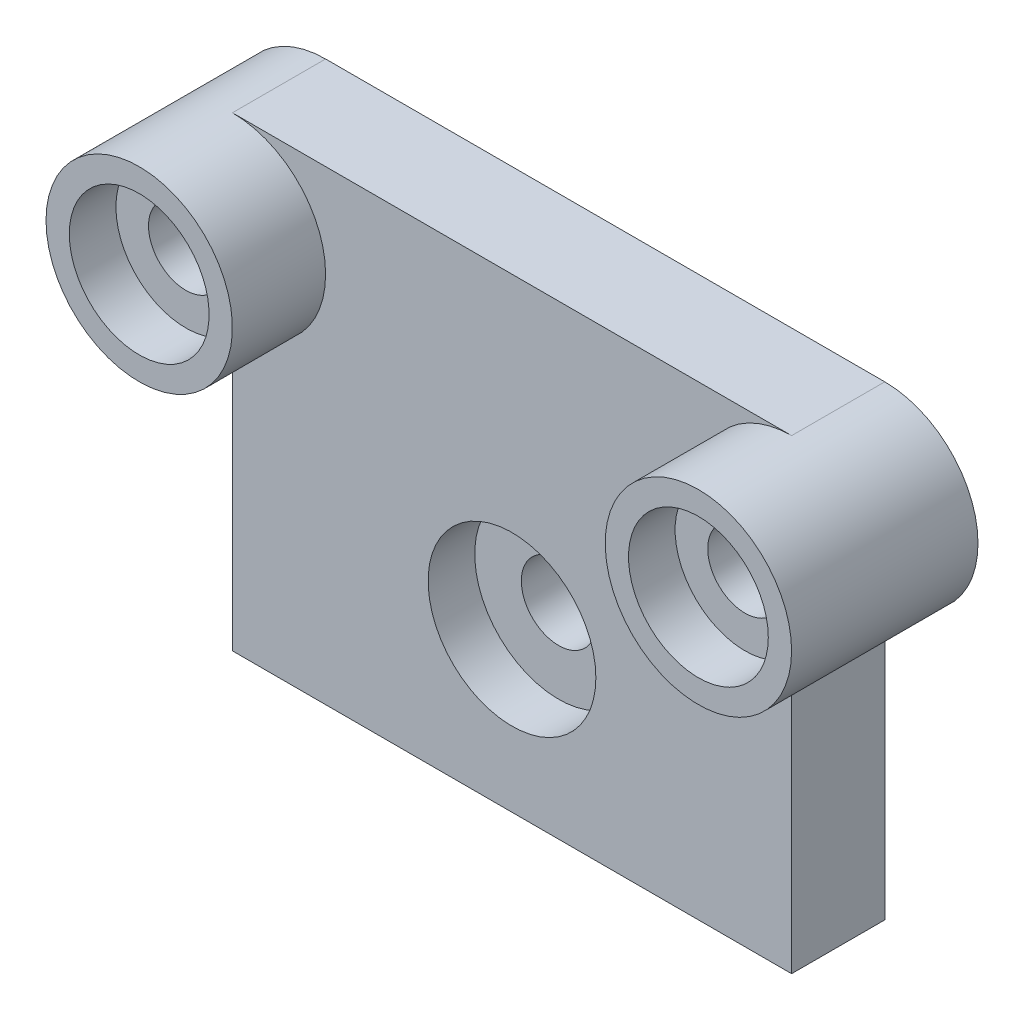
ISO-10303-21;
HEADER;
FILE_DESCRIPTION(('STEP AP214'),'2;1');
FILE_NAME('part.step','',(''),(''),'','','');
FILE_SCHEMA(('AUTOMOTIVE_DESIGN { 1 0 10303 214 1 1 1 1 }'));
ENDSEC;
DATA;
#1=APPLICATION_CONTEXT('core data for automotive mechanical design processes');
#2=APPLICATION_PROTOCOL_DEFINITION('international standard','automotive_design',2000,#1);
#3=PRODUCT_CONTEXT('',#1,'mechanical');
#4=PRODUCT('Part','Part','',(#3));
#5=PRODUCT_RELATED_PRODUCT_CATEGORY('part','',(#4));
#6=PRODUCT_DEFINITION_FORMATION('','',#4);
#7=PRODUCT_DEFINITION_CONTEXT('part definition',#1,'design');
#8=PRODUCT_DEFINITION('design','',#6,#7);
#9=PRODUCT_DEFINITION_SHAPE('','',#8);
#10=(LENGTH_UNIT() NAMED_UNIT(*) SI_UNIT(.MILLI.,.METRE.));
#11=(NAMED_UNIT(*) PLANE_ANGLE_UNIT() SI_UNIT($,.RADIAN.));
#12=(NAMED_UNIT(*) SI_UNIT($,.STERADIAN.) SOLID_ANGLE_UNIT());
#13=UNCERTAINTY_MEASURE_WITH_UNIT(LENGTH_MEASURE(1.E-05),#10,'distance_accuracy_value','');
#14=(GEOMETRIC_REPRESENTATION_CONTEXT(3) GLOBAL_UNCERTAINTY_ASSIGNED_CONTEXT((#13)) GLOBAL_UNIT_ASSIGNED_CONTEXT((#10,
#11,#12)) REPRESENTATION_CONTEXT('',''));
#15=CARTESIAN_POINT('',(0.,0.,0.));
#16=DIRECTION('',(0.,0.,1.));
#17=DIRECTION('',(1.,0.,0.));
#18=AXIS2_PLACEMENT_3D('',#15,#16,#17);
#19=CARTESIAN_POINT('',(-15.,-8.,10.));
#20=DIRECTION('',(0.,0.,-1.));
#21=DIRECTION('',(-1.,0.,0.));
#22=AXIS2_PLACEMENT_3D('',#19,#20,#21);
#23=CYLINDRICAL_SURFACE('',#22,4.);
#24=CARTESIAN_POINT('',(-15.,-8.,0.));
#25=DIRECTION('',(0.,0.,1.));
#26=DIRECTION('',(1.,0.,0.));
#27=AXIS2_PLACEMENT_3D('',#24,#25,#26);
#28=CIRCLE('',#27,4.);
#29=CARTESIAN_POINT('',(-11.,-8.,0.));
#30=VERTEX_POINT('',#29);
#31=EDGE_CURVE('E108',#30,#30,#28,.T.);
#32=ORIENTED_EDGE('',*,*,#31,.F.);
#33=EDGE_LOOP('',(#32));
#34=FACE_BOUND('',#33,.T.);
#35=CARTESIAN_POINT('',(-15.,-8.,5.));
#36=DIRECTION('',(0.,0.,1.));
#37=DIRECTION('',(1.,0.,0.));
#38=AXIS2_PLACEMENT_3D('',#35,#36,#37);
#39=CIRCLE('',#38,4.);
#40=CARTESIAN_POINT('',(-11.,-8.,5.));
#41=VERTEX_POINT('',#40);
#42=EDGE_CURVE('E51',#41,#41,#39,.T.);
#43=ORIENTED_EDGE('',*,*,#42,.T.);
#44=EDGE_LOOP('',(#43));
#45=FACE_BOUND('',#44,.T.);
#46=ADVANCED_FACE('F47',(#34,#45),#23,.F.);
#47=CARTESIAN_POINT('',(-45.,15.,10.));
#48=DIRECTION('',(0.,0.,-1.));
#49=DIRECTION('',(-1.,0.,0.));
#50=AXIS2_PLACEMENT_3D('',#47,#48,#49);
#51=CYLINDRICAL_SURFACE('',#50,4.);
#52=CARTESIAN_POINT('',(-45.,15.,0.));
#53=DIRECTION('',(0.,0.,-1.));
#54=DIRECTION('',(-1.,0.,0.));
#55=AXIS2_PLACEMENT_3D('',#52,#53,#54);
#56=CIRCLE('',#55,4.);
#57=CARTESIAN_POINT('',(-49.,15.,0.));
#58=VERTEX_POINT('',#57);
#59=EDGE_CURVE('E152',#58,#58,#56,.T.);
#60=ORIENTED_EDGE('',*,*,#59,.T.);
#61=EDGE_LOOP('',(#60));
#62=FACE_BOUND('',#61,.T.);
#63=CARTESIAN_POINT('',(-45.,15.,15.));
#64=DIRECTION('',(0.,0.,1.));
#65=DIRECTION('',(1.,0.,0.));
#66=AXIS2_PLACEMENT_3D('',#63,#64,#65);
#67=CIRCLE('',#66,4.);
#68=CARTESIAN_POINT('',(-41.,15.,15.));
#69=VERTEX_POINT('',#68);
#70=EDGE_CURVE('E125',#69,#69,#67,.F.);
#71=ORIENTED_EDGE('',*,*,#70,.F.);
#72=EDGE_LOOP('',(#71));
#73=FACE_BOUND('',#72,.T.);
#74=ADVANCED_FACE('F192',(#62,#73),#51,.F.);
#75=CARTESIAN_POINT('',(-30.,0.,20.));
#76=DIRECTION('',(0.,0.,1.));
#77=DIRECTION('',(-1.,0.,0.));
#78=AXIS2_PLACEMENT_3D('',#75,#76,#77);
#79=PLANE('',#78);
#80=CARTESIAN_POINT('',(-45.,15.,20.));
#81=DIRECTION('',(0.,0.,-1.));
#82=DIRECTION('',(-1.,0.,0.));
#83=AXIS2_PLACEMENT_3D('',#80,#81,#82);
#84=CIRCLE('',#83,10.);
#85=CARTESIAN_POINT('',(-55.,15.,20.));
#86=VERTEX_POINT('',#85);
#87=EDGE_CURVE('E127',#86,#86,#84,.T.);
#88=ORIENTED_EDGE('',*,*,#87,.F.);
#89=EDGE_LOOP('',(#88));
#90=FACE_BOUND('',#89,.T.);
#91=CARTESIAN_POINT('',(-45.,15.,20.));
#92=DIRECTION('',(0.,0.,-1.));
#93=DIRECTION('',(-1.,0.,0.));
#94=AXIS2_PLACEMENT_3D('',#91,#92,#93);
#95=CIRCLE('',#94,7.5);
#96=CARTESIAN_POINT('',(-52.5,15.,20.));
#97=VERTEX_POINT('',#96);
#98=EDGE_CURVE('E135',#97,#97,#95,.T.);
#99=ORIENTED_EDGE('',*,*,#98,.T.);
#100=EDGE_LOOP('',(#99));
#101=FACE_BOUND('',#100,.T.);
#102=ADVANCED_FACE('F197',(#90,#101),#79,.T.);
#103=CARTESIAN_POINT('',(15.,15.,10.));
#104=DIRECTION('',(0.,0.,-1.));
#105=DIRECTION('',(-1.,0.,0.));
#106=AXIS2_PLACEMENT_3D('',#103,#104,#105);
#107=CYLINDRICAL_SURFACE('',#106,4.);
#108=CARTESIAN_POINT('',(15.,15.,0.));
#109=DIRECTION('',(0.,0.,1.));
#110=DIRECTION('',(1.,0.,0.));
#111=AXIS2_PLACEMENT_3D('',#108,#109,#110);
#112=CIRCLE('',#111,4.);
#113=CARTESIAN_POINT('',(19.,15.,0.));
#114=VERTEX_POINT('',#113);
#115=EDGE_CURVE('E91',#114,#114,#112,.T.);
#116=ORIENTED_EDGE('',*,*,#115,.F.);
#117=EDGE_LOOP('',(#116));
#118=FACE_BOUND('',#117,.T.);
#119=CARTESIAN_POINT('',(15.,15.,15.));
#120=DIRECTION('',(0.,0.,1.));
#121=DIRECTION('',(1.,0.,0.));
#122=AXIS2_PLACEMENT_3D('',#119,#120,#121);
#123=CIRCLE('',#122,4.);
#124=CARTESIAN_POINT('',(19.,15.,15.));
#125=VERTEX_POINT('',#124);
#126=EDGE_CURVE('E122',#125,#125,#123,.T.);
#127=ORIENTED_EDGE('',*,*,#126,.T.);
#128=EDGE_LOOP('',(#127));
#129=FACE_BOUND('',#128,.T.);
#130=ADVANCED_FACE('F215',(#118,#129),#107,.F.);
#131=CARTESIAN_POINT('',(0.,0.,10.));
#132=DIRECTION('',(0.,0.,1.));
#133=DIRECTION('',(1.,0.,0.));
#134=AXIS2_PLACEMENT_3D('',#131,#132,#133);
#135=PLANE('',#134);
#136=CARTESIAN_POINT('',(-15.,-8.,10.));
#137=DIRECTION('',(0.,0.,1.));
#138=DIRECTION('',(1.,0.,0.));
#139=AXIS2_PLACEMENT_3D('',#136,#137,#138);
#140=CIRCLE('',#139,9.);
#141=CARTESIAN_POINT('',(-6.,-8.,10.));
#142=VERTEX_POINT('',#141);
#143=EDGE_CURVE('E142',#142,#142,#140,.T.);
#144=ORIENTED_EDGE('',*,*,#143,.F.);
#145=EDGE_LOOP('',(#144));
#146=FACE_BOUND('',#145,.T.);
#147=CARTESIAN_POINT('',(-45.,15.,10.));
#148=DIRECTION('',(0.,0.,1.));
#149=DIRECTION('',(1.,0.,0.));
#150=AXIS2_PLACEMENT_3D('',#147,#148,#149);
#151=CIRCLE('',#150,10.);
#152=CARTESIAN_POINT('',(-45.,5.,10.));
#153=VERTEX_POINT('',#152);
#154=CARTESIAN_POINT('',(-45.,25.,10.));
#155=VERTEX_POINT('',#154);
#156=EDGE_CURVE('E132',#153,#155,#151,.T.);
#157=ORIENTED_EDGE('',*,*,#156,.F.);
#158=DIRECTION('',(0.,1.,0.));
#159=VECTOR('',#158,1.);
#160=CARTESIAN_POINT('',(-45.,0.,10.));
#161=LINE('',#160,#159);
#162=CARTESIAN_POINT('',(-45.,-25.,10.));
#163=VERTEX_POINT('',#162);
#164=EDGE_CURVE('E148',#163,#153,#161,.T.);
#165=ORIENTED_EDGE('',*,*,#164,.F.);
#166=DIRECTION('',(1.,0.,0.));
#167=VECTOR('',#166,1.);
#168=CARTESIAN_POINT('',(0.,-25.,10.));
#169=LINE('',#168,#167);
#170=CARTESIAN_POINT('',(15.,-25.,10.));
#171=VERTEX_POINT('',#170);
#172=EDGE_CURVE('E173',#163,#171,#169,.T.);
#173=ORIENTED_EDGE('',*,*,#172,.T.);
#174=DIRECTION('',(0.,1.,0.));
#175=VECTOR('',#174,1.);
#176=CARTESIAN_POINT('',(15.,0.,10.));
#177=LINE('',#176,#175);
#178=CARTESIAN_POINT('',(15.,5.,10.));
#179=VERTEX_POINT('',#178);
#180=EDGE_CURVE('E66',#171,#179,#177,.T.);
#181=ORIENTED_EDGE('',*,*,#180,.T.);
#182=CARTESIAN_POINT('',(15.,15.,10.));
#183=DIRECTION('',(0.,0.,1.));
#184=DIRECTION('',(1.,0.,0.));
#185=AXIS2_PLACEMENT_3D('',#182,#183,#184);
#186=CIRCLE('',#185,10.);
#187=CARTESIAN_POINT('',(15.,25.,10.));
#188=VERTEX_POINT('',#187);
#189=EDGE_CURVE('E99',#179,#188,#186,.F.);
#190=ORIENTED_EDGE('',*,*,#189,.T.);
#191=DIRECTION('',(1.,0.,0.));
#192=VECTOR('',#191,1.);
#193=CARTESIAN_POINT('',(0.,25.,10.));
#194=LINE('',#193,#192);
#195=EDGE_CURVE('E119',#155,#188,#194,.T.);
#196=ORIENTED_EDGE('',*,*,#195,.F.);
#197=EDGE_LOOP('',(#157,#165,#173,#181,#190,#196));
#198=FACE_BOUND('',#197,.T.);
#199=ADVANCED_FACE('F177',(#146,#198),#135,.T.);
#200=CARTESIAN_POINT('',(15.,15.,10.));
#201=DIRECTION('',(0.,0.,-1.));
#202=DIRECTION('',(-1.,0.,0.));
#203=AXIS2_PLACEMENT_3D('',#200,#201,#202);
#204=CYLINDRICAL_SURFACE('',#203,10.);
#205=CARTESIAN_POINT('',(15.,15.,0.));
#206=DIRECTION('',(0.,0.,1.));
#207=DIRECTION('',(1.,0.,0.));
#208=AXIS2_PLACEMENT_3D('',#205,#206,#207);
#209=CIRCLE('',#208,10.);
#210=CARTESIAN_POINT('',(15.,5.,0.));
#211=VERTEX_POINT('',#210);
#212=CARTESIAN_POINT('',(15.,25.,0.));
#213=VERTEX_POINT('',#212);
#214=EDGE_CURVE('E97',#211,#213,#209,.T.);
#215=ORIENTED_EDGE('',*,*,#214,.T.);
#216=DIRECTION('',(0.,0.,-1.));
#217=VECTOR('',#216,1.);
#218=CARTESIAN_POINT('',(15.,25.,10.));
#219=LINE('',#218,#217);
#220=EDGE_CURVE('E13',#188,#213,#219,.T.);
#221=ORIENTED_EDGE('',*,*,#220,.F.);
#222=ORIENTED_EDGE('',*,*,#189,.F.);
#223=DIRECTION('',(0.,0.,-1.));
#224=VECTOR('',#223,1.);
#225=CARTESIAN_POINT('',(15.,5.,10.));
#226=LINE('',#225,#224);
#227=EDGE_CURVE('E87',#179,#211,#226,.T.);
#228=ORIENTED_EDGE('',*,*,#227,.T.);
#229=EDGE_LOOP('',(#215,#221,#222,#228));
#230=FACE_BOUND('',#229,.T.);
#231=CARTESIAN_POINT('',(15.,15.,20.));
#232=DIRECTION('',(0.,0.,1.));
#233=DIRECTION('',(1.,0.,0.));
#234=AXIS2_PLACEMENT_3D('',#231,#232,#233);
#235=CIRCLE('',#234,10.);
#236=CARTESIAN_POINT('',(25.,15.,20.));
#237=VERTEX_POINT('',#236);
#238=EDGE_CURVE('E110',#237,#237,#235,.T.);
#239=ORIENTED_EDGE('',*,*,#238,.F.);
#240=EDGE_LOOP('',(#239));
#241=FACE_BOUND('',#240,.T.);
#242=ADVANCED_FACE('F49',(#230,#241),#204,.T.);
#243=CARTESIAN_POINT('',(0.,25.,10.));
#244=DIRECTION('',(0.,1.,0.));
#245=DIRECTION('',(0.,0.,1.));
#246=AXIS2_PLACEMENT_3D('',#243,#244,#245);
#247=PLANE('',#246);
#248=DIRECTION('',(1.,0.,0.));
#249=VECTOR('',#248,1.);
#250=CARTESIAN_POINT('',(0.,25.,0.));
#251=LINE('',#250,#249);
#252=CARTESIAN_POINT('',(-45.,25.,0.));
#253=VERTEX_POINT('',#252);
#254=EDGE_CURVE('E106',#253,#213,#251,.T.);
#255=ORIENTED_EDGE('',*,*,#254,.F.);
#256=DIRECTION('',(0.,0.,-1.));
#257=VECTOR('',#256,1.);
#258=CARTESIAN_POINT('',(-45.,25.,10.));
#259=LINE('',#258,#257);
#260=EDGE_CURVE('E151',#155,#253,#259,.T.);
#261=ORIENTED_EDGE('',*,*,#260,.F.);
#262=ORIENTED_EDGE('',*,*,#195,.T.);
#263=ORIENTED_EDGE('',*,*,#220,.T.);
#264=EDGE_LOOP('',(#255,#261,#262,#263));
#265=FACE_BOUND('',#264,.T.);
#266=ADVANCED_FACE('F182',(#265),#247,.T.);
#267=CARTESIAN_POINT('',(0.,-25.,10.));
#268=DIRECTION('',(0.,1.,0.));
#269=DIRECTION('',(0.,0.,1.));
#270=AXIS2_PLACEMENT_3D('',#267,#268,#269);
#271=PLANE('',#270);
#272=DIRECTION('',(1.,0.,0.));
#273=VECTOR('',#272,1.);
#274=CARTESIAN_POINT('',(0.,-25.,0.));
#275=LINE('',#274,#273);
#276=CARTESIAN_POINT('',(-45.,-25.,0.));
#277=VERTEX_POINT('',#276);
#278=CARTESIAN_POINT('',(15.,-25.,0.));
#279=VERTEX_POINT('',#278);
#280=EDGE_CURVE('E79',#277,#279,#275,.T.);
#281=ORIENTED_EDGE('',*,*,#280,.T.);
#282=DIRECTION('',(0.,0.,-1.));
#283=VECTOR('',#282,1.);
#284=CARTESIAN_POINT('',(15.,-25.,10.));
#285=LINE('',#284,#283);
#286=EDGE_CURVE('E57',#171,#279,#285,.T.);
#287=ORIENTED_EDGE('',*,*,#286,.F.);
#288=ORIENTED_EDGE('',*,*,#172,.F.);
#289=DIRECTION('',(0.,0.,-1.));
#290=VECTOR('',#289,1.);
#291=CARTESIAN_POINT('',(-45.,-25.,10.));
#292=LINE('',#291,#290);
#293=EDGE_CURVE('E160',#163,#277,#292,.T.);
#294=ORIENTED_EDGE('',*,*,#293,.T.);
#295=EDGE_LOOP('',(#281,#287,#288,#294));
#296=FACE_BOUND('',#295,.T.);
#297=ADVANCED_FACE('F180',(#296),#271,.F.);
#298=CARTESIAN_POINT('',(15.,0.,10.));
#299=DIRECTION('',(-1.,0.,0.));
#300=DIRECTION('',(0.,0.,1.));
#301=AXIS2_PLACEMENT_3D('',#298,#299,#300);
#302=PLANE('',#301);
#303=DIRECTION('',(0.,1.,0.));
#304=VECTOR('',#303,1.);
#305=CARTESIAN_POINT('',(15.,0.,0.));
#306=LINE('',#305,#304);
#307=EDGE_CURVE('E84',#279,#211,#306,.T.);
#308=ORIENTED_EDGE('',*,*,#307,.T.);
#309=ORIENTED_EDGE('',*,*,#227,.F.);
#310=ORIENTED_EDGE('',*,*,#180,.F.);
#311=ORIENTED_EDGE('',*,*,#286,.T.);
#312=EDGE_LOOP('',(#308,#309,#310,#311));
#313=FACE_BOUND('',#312,.T.);
#314=ADVANCED_FACE('F86',(#313),#302,.F.);
#315=CARTESIAN_POINT('',(0.,0.,0.));
#316=DIRECTION('',(0.,0.,1.));
#317=DIRECTION('',(1.,0.,0.));
#318=AXIS2_PLACEMENT_3D('',#315,#316,#317);
#319=PLANE('',#318);
#320=ORIENTED_EDGE('',*,*,#31,.T.);
#321=EDGE_LOOP('',(#320));
#322=FACE_BOUND('',#321,.T.);
#323=DIRECTION('',(0.,1.,0.));
#324=VECTOR('',#323,1.);
#325=CARTESIAN_POINT('',(-45.,0.,0.));
#326=LINE('',#325,#324);
#327=CARTESIAN_POINT('',(-45.,5.,0.));
#328=VERTEX_POINT('',#327);
#329=EDGE_CURVE('E154',#277,#328,#326,.T.);
#330=ORIENTED_EDGE('',*,*,#329,.T.);
#331=CARTESIAN_POINT('',(-45.,15.,0.));
#332=DIRECTION('',(0.,0.,-1.));
#333=DIRECTION('',(-1.,0.,0.));
#334=AXIS2_PLACEMENT_3D('',#331,#332,#333);
#335=CIRCLE('',#334,10.);
#336=EDGE_CURVE('E147',#328,#253,#335,.T.);
#337=ORIENTED_EDGE('',*,*,#336,.T.);
#338=ORIENTED_EDGE('',*,*,#254,.T.);
#339=ORIENTED_EDGE('',*,*,#214,.F.);
#340=ORIENTED_EDGE('',*,*,#307,.F.);
#341=ORIENTED_EDGE('',*,*,#280,.F.);
#342=EDGE_LOOP('',(#330,#337,#338,#339,#340,#341));
#343=FACE_BOUND('',#342,.T.);
#344=ORIENTED_EDGE('',*,*,#115,.T.);
#345=EDGE_LOOP('',(#344));
#346=FACE_BOUND('',#345,.T.);
#347=ORIENTED_EDGE('',*,*,#59,.F.);
#348=EDGE_LOOP('',(#347));
#349=FACE_BOUND('',#348,.T.);
#350=ADVANCED_FACE('F102',(#322,#343,#346,#349),#319,.F.);
#351=CARTESIAN_POINT('',(0.,0.,20.));
#352=DIRECTION('',(0.,0.,1.));
#353=DIRECTION('',(1.,0.,0.));
#354=AXIS2_PLACEMENT_3D('',#351,#352,#353);
#355=PLANE('',#354);
#356=CARTESIAN_POINT('',(15.,15.,20.));
#357=DIRECTION('',(0.,0.,1.));
#358=DIRECTION('',(1.,0.,0.));
#359=AXIS2_PLACEMENT_3D('',#356,#357,#358);
#360=CIRCLE('',#359,7.5);
#361=CARTESIAN_POINT('',(22.5,15.,20.));
#362=VERTEX_POINT('',#361);
#363=EDGE_CURVE('E165',#362,#362,#360,.T.);
#364=ORIENTED_EDGE('',*,*,#363,.F.);
#365=EDGE_LOOP('',(#364));
#366=FACE_BOUND('',#365,.T.);
#367=ORIENTED_EDGE('',*,*,#238,.T.);
#368=EDGE_LOOP('',(#367));
#369=FACE_BOUND('',#368,.T.);
#370=ADVANCED_FACE('F225',(#366,#369),#355,.T.);
#371=CARTESIAN_POINT('',(15.,15.,15.));
#372=DIRECTION('',(0.,0.,1.));
#373=DIRECTION('',(1.,0.,0.));
#374=AXIS2_PLACEMENT_3D('',#371,#372,#373);
#375=CYLINDRICAL_SURFACE('',#374,7.5);
#376=CARTESIAN_POINT('',(15.,15.,15.));
#377=DIRECTION('',(0.,0.,1.));
#378=DIRECTION('',(1.,0.,0.));
#379=AXIS2_PLACEMENT_3D('',#376,#377,#378);
#380=CIRCLE('',#379,7.5);
#381=CARTESIAN_POINT('',(22.5,15.,15.));
#382=VERTEX_POINT('',#381);
#383=EDGE_CURVE('E124',#382,#382,#380,.T.);
#384=ORIENTED_EDGE('',*,*,#383,.F.);
#385=EDGE_LOOP('',(#384));
#386=FACE_BOUND('',#385,.T.);
#387=ORIENTED_EDGE('',*,*,#363,.T.);
#388=EDGE_LOOP('',(#387));
#389=FACE_BOUND('',#388,.T.);
#390=ADVANCED_FACE('F232',(#386,#389),#375,.F.);
#391=CARTESIAN_POINT('',(15.,15.,15.));
#392=DIRECTION('',(0.,0.,1.));
#393=DIRECTION('',(1.,0.,0.));
#394=AXIS2_PLACEMENT_3D('',#391,#392,#393);
#395=PLANE('',#394);
#396=ORIENTED_EDGE('',*,*,#126,.F.);
#397=EDGE_LOOP('',(#396));
#398=FACE_BOUND('',#397,.T.);
#399=ORIENTED_EDGE('',*,*,#383,.T.);
#400=EDGE_LOOP('',(#399));
#401=FACE_BOUND('',#400,.T.);
#402=ADVANCED_FACE('F237',(#398,#401),#395,.T.);
#403=CARTESIAN_POINT('',(-45.,15.,10.));
#404=DIRECTION('',(0.,0.,-1.));
#405=DIRECTION('',(-1.,0.,0.));
#406=AXIS2_PLACEMENT_3D('',#403,#404,#405);
#407=CYLINDRICAL_SURFACE('',#406,10.);
#408=ORIENTED_EDGE('',*,*,#336,.F.);
#409=DIRECTION('',(0.,0.,-1.));
#410=VECTOR('',#409,1.);
#411=CARTESIAN_POINT('',(-45.,5.,10.));
#412=LINE('',#411,#410);
#413=EDGE_CURVE('E162',#153,#328,#412,.T.);
#414=ORIENTED_EDGE('',*,*,#413,.F.);
#415=ORIENTED_EDGE('',*,*,#156,.T.);
#416=ORIENTED_EDGE('',*,*,#260,.T.);
#417=EDGE_LOOP('',(#408,#414,#415,#416));
#418=FACE_BOUND('',#417,.T.);
#419=ORIENTED_EDGE('',*,*,#87,.T.);
#420=EDGE_LOOP('',(#419));
#421=FACE_BOUND('',#420,.T.);
#422=ADVANCED_FACE('F246',(#418,#421),#407,.T.);
#423=CARTESIAN_POINT('',(-45.,0.,10.));
#424=DIRECTION('',(-1.,0.,0.));
#425=DIRECTION('',(0.,0.,1.));
#426=AXIS2_PLACEMENT_3D('',#423,#424,#425);
#427=PLANE('',#426);
#428=ORIENTED_EDGE('',*,*,#329,.F.);
#429=ORIENTED_EDGE('',*,*,#293,.F.);
#430=ORIENTED_EDGE('',*,*,#164,.T.);
#431=ORIENTED_EDGE('',*,*,#413,.T.);
#432=EDGE_LOOP('',(#428,#429,#430,#431));
#433=FACE_BOUND('',#432,.T.);
#434=ADVANCED_FACE('F253',(#433),#427,.T.);
#435=CARTESIAN_POINT('',(-45.,15.,15.));
#436=DIRECTION('',(0.,0.,1.));
#437=DIRECTION('',(-1.,0.,0.));
#438=AXIS2_PLACEMENT_3D('',#435,#436,#437);
#439=PLANE('',#438);
#440=CARTESIAN_POINT('',(-45.,15.,15.));
#441=DIRECTION('',(0.,0.,-1.));
#442=DIRECTION('',(-1.,0.,0.));
#443=AXIS2_PLACEMENT_3D('',#440,#441,#442);
#444=CIRCLE('',#443,7.5);
#445=CARTESIAN_POINT('',(-52.5,15.,15.));
#446=VERTEX_POINT('',#445);
#447=EDGE_CURVE('E128',#446,#446,#444,.T.);
#448=ORIENTED_EDGE('',*,*,#447,.F.);
#449=EDGE_LOOP('',(#448));
#450=FACE_BOUND('',#449,.T.);
#451=ORIENTED_EDGE('',*,*,#70,.T.);
#452=EDGE_LOOP('',(#451));
#453=FACE_BOUND('',#452,.T.);
#454=ADVANCED_FACE('F256',(#450,#453),#439,.T.);
#455=CARTESIAN_POINT('',(-45.,15.,15.));
#456=DIRECTION('',(0.,0.,1.));
#457=DIRECTION('',(1.,0.,0.));
#458=AXIS2_PLACEMENT_3D('',#455,#456,#457);
#459=CYLINDRICAL_SURFACE('',#458,7.5);
#460=ORIENTED_EDGE('',*,*,#447,.T.);
#461=EDGE_LOOP('',(#460));
#462=FACE_BOUND('',#461,.T.);
#463=ORIENTED_EDGE('',*,*,#98,.F.);
#464=EDGE_LOOP('',(#463));
#465=FACE_BOUND('',#464,.T.);
#466=ADVANCED_FACE('F262',(#462,#465),#459,.F.);
#467=CARTESIAN_POINT('',(-15.,-8.,5.));
#468=DIRECTION('',(0.,0.,1.));
#469=DIRECTION('',(1.,0.,0.));
#470=AXIS2_PLACEMENT_3D('',#467,#468,#469);
#471=CYLINDRICAL_SURFACE('',#470,9.);
#472=CARTESIAN_POINT('',(-15.,-8.,5.));
#473=DIRECTION('',(0.,0.,1.));
#474=DIRECTION('',(1.,0.,0.));
#475=AXIS2_PLACEMENT_3D('',#472,#473,#474);
#476=CIRCLE('',#475,9.);
#477=CARTESIAN_POINT('',(-6.,-8.,5.));
#478=VERTEX_POINT('',#477);
#479=EDGE_CURVE('E205',#478,#478,#476,.T.);
#480=ORIENTED_EDGE('',*,*,#479,.F.);
#481=EDGE_LOOP('',(#480));
#482=FACE_BOUND('',#481,.T.);
#483=ORIENTED_EDGE('',*,*,#143,.T.);
#484=EDGE_LOOP('',(#483));
#485=FACE_BOUND('',#484,.T.);
#486=ADVANCED_FACE('F212',(#482,#485),#471,.F.);
#487=CARTESIAN_POINT('',(-15.,-8.,5.));
#488=DIRECTION('',(0.,0.,1.));
#489=DIRECTION('',(1.,0.,0.));
#490=AXIS2_PLACEMENT_3D('',#487,#488,#489);
#491=PLANE('',#490);
#492=ORIENTED_EDGE('',*,*,#42,.F.);
#493=EDGE_LOOP('',(#492));
#494=FACE_BOUND('',#493,.T.);
#495=ORIENTED_EDGE('',*,*,#479,.T.);
#496=EDGE_LOOP('',(#495));
#497=FACE_BOUND('',#496,.T.);
#498=ADVANCED_FACE('F270',(#494,#497),#491,.T.);
#499=CLOSED_SHELL('',(#46,#74,#102,#130,#199,#242,#266,#297,#314,#350,#370,#390,#402,#422,#434,
#454,#466,#486,#498));
#500=MANIFOLD_SOLID_BREP('B2',#499);
#501=ADVANCED_BREP_SHAPE_REPRESENTATION('',(#18,#500),#14);
#502=SHAPE_DEFINITION_REPRESENTATION(#9,#501);
ENDSEC;
END-ISO-10303-21;
